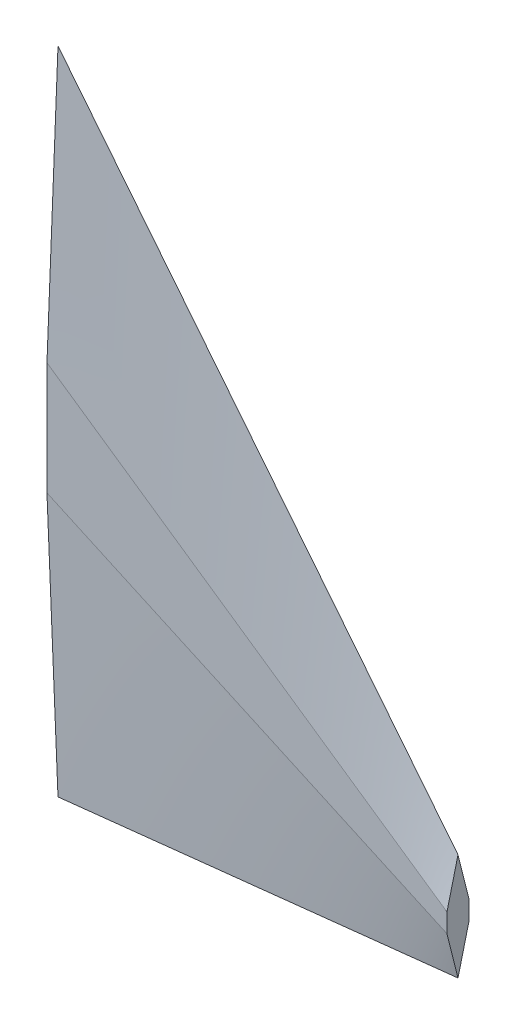
ISO-10303-21;
HEADER;
FILE_DESCRIPTION(('STEP AP214'),'2;1');
FILE_NAME('part.step','',(''),(''),'','','');
FILE_SCHEMA(('AUTOMOTIVE_DESIGN { 1 0 10303 214 1 1 1 1 }'));
ENDSEC;
DATA;
#1=APPLICATION_CONTEXT('core data for automotive mechanical design processes');
#2=APPLICATION_PROTOCOL_DEFINITION('international standard','automotive_design',2000,#1);
#3=PRODUCT_CONTEXT('',#1,'mechanical');
#4=PRODUCT('Part','Part','',(#3));
#5=PRODUCT_RELATED_PRODUCT_CATEGORY('part','',(#4));
#6=PRODUCT_DEFINITION_FORMATION('','',#4);
#7=PRODUCT_DEFINITION_CONTEXT('part definition',#1,'design');
#8=PRODUCT_DEFINITION('design','',#6,#7);
#9=PRODUCT_DEFINITION_SHAPE('','',#8);
#10=(LENGTH_UNIT() NAMED_UNIT(*) SI_UNIT(.MILLI.,.METRE.));
#11=(NAMED_UNIT(*) PLANE_ANGLE_UNIT() SI_UNIT($,.RADIAN.));
#12=(NAMED_UNIT(*) SI_UNIT($,.STERADIAN.) SOLID_ANGLE_UNIT());
#13=UNCERTAINTY_MEASURE_WITH_UNIT(LENGTH_MEASURE(1.E-05),#10,'distance_accuracy_value','');
#14=(GEOMETRIC_REPRESENTATION_CONTEXT(3) GLOBAL_UNCERTAINTY_ASSIGNED_CONTEXT((#13)) GLOBAL_UNIT_ASSIGNED_CONTEXT((#10,
#11,#12)) REPRESENTATION_CONTEXT('',''));
#15=CARTESIAN_POINT('',(0.,0.,0.));
#16=DIRECTION('',(0.,0.,1.));
#17=DIRECTION('',(1.,0.,0.));
#18=AXIS2_PLACEMENT_3D('',#15,#16,#17);
#19=CARTESIAN_POINT('',(91.39,0.,0.));
#20=DIRECTION('',(-1.,0.,0.));
#21=DIRECTION('',(0.,0.,1.));
#22=AXIS2_PLACEMENT_3D('',#19,#20,#21);
#23=PLANE('',#22);
#24=DIRECTION('',(0.,-0.969848293101963,-0.243709434300785));
#25=VECTOR('',#24,1.);
#26=CARTESIAN_POINT('',(91.39,-64.424,0.));
#27=LINE('',#26,#25);
#28=CARTESIAN_POINT('',(91.39,-54.391,2.52115384615387));
#29=VERTEX_POINT('',#28);
#30=CARTESIAN_POINT('',(91.39,-64.424,0.));
#31=VERTEX_POINT('',#30);
#32=EDGE_CURVE('E266',#29,#31,#27,.T.);
#33=ORIENTED_EDGE('',*,*,#32,.T.);
#34=DIRECTION('',(0.,0.969848293101963,-0.243709434300785));
#35=VECTOR('',#34,1.);
#36=CARTESIAN_POINT('',(91.39,-64.424,0.));
#37=LINE('',#36,#35);
#38=CARTESIAN_POINT('',(91.39,-54.391,-2.52115384615387));
#39=VERTEX_POINT('',#38);
#40=EDGE_CURVE('E12',#31,#39,#37,.T.);
#41=ORIENTED_EDGE('',*,*,#40,.T.);
#42=DIRECTION('',(0.,1.,0.));
#43=VECTOR('',#42,1.);
#44=CARTESIAN_POINT('',(91.39,-54.391,-2.52115384615387));
#45=LINE('',#44,#43);
#46=CARTESIAN_POINT('',(91.39,-50.073,-2.52115384615387));
#47=VERTEX_POINT('',#46);
#48=EDGE_CURVE('E60',#39,#47,#45,.T.);
#49=ORIENTED_EDGE('',*,*,#48,.T.);
#50=DIRECTION('',(0.,0.969848293101963,0.243709434300785));
#51=VECTOR('',#50,1.);
#52=CARTESIAN_POINT('',(91.39,-50.073,-2.52115384615387));
#53=LINE('',#52,#51);
#54=CARTESIAN_POINT('',(91.39,-40.04,0.));
#55=VERTEX_POINT('',#54);
#56=EDGE_CURVE('E300',#47,#55,#53,.T.);
#57=ORIENTED_EDGE('',*,*,#56,.T.);
#58=DIRECTION('',(0.,-0.969848293101963,0.243709434300785));
#59=VECTOR('',#58,1.);
#60=CARTESIAN_POINT('',(91.39,-50.073,2.52115384615387));
#61=LINE('',#60,#59);
#62=CARTESIAN_POINT('',(91.39,-50.073,2.52115384615387));
#63=VERTEX_POINT('',#62);
#64=EDGE_CURVE('E74',#55,#63,#61,.T.);
#65=ORIENTED_EDGE('',*,*,#64,.T.);
#66=DIRECTION('',(0.,-1.,0.));
#67=VECTOR('',#66,1.);
#68=CARTESIAN_POINT('',(91.39,-54.391,2.52115384615387));
#69=LINE('',#68,#67);
#70=EDGE_CURVE('E68',#63,#29,#69,.T.);
#71=ORIENTED_EDGE('',*,*,#70,.T.);
#72=EDGE_LOOP('',(#33,#41,#49,#57,#65,#71));
#73=FACE_BOUND('',#72,.T.);
#74=ADVANCED_FACE('F50',(#73),#23,.F.);
#75=CARTESIAN_POINT('',(0.,0.,0.));
#76=DIRECTION('',(1.,0.,0.));
#77=DIRECTION('',(0.,0.,-1.));
#78=AXIS2_PLACEMENT_3D('',#75,#76,#77);
#79=PLANE('',#78);
#80=DIRECTION('',(0.,-0.999158603528769,0.0410132295051167));
#81=VECTOR('',#80,1.);
#82=CARTESIAN_POINT('',(0.,74.29,0.));
#83=LINE('',#82,#81);
#84=CARTESIAN_POINT('',(0.,74.29,0.));
#85=VERTEX_POINT('',#84);
#86=CARTESIAN_POINT('',(0.,12.87,2.52115384615386));
#87=VERTEX_POINT('',#86);
#88=EDGE_CURVE('E111',#85,#87,#83,.T.);
#89=ORIENTED_EDGE('',*,*,#88,.F.);
#90=DIRECTION('',(0.,0.999158603528769,0.041013229505117));
#91=VECTOR('',#90,1.);
#92=CARTESIAN_POINT('',(0.,74.29,0.));
#93=LINE('',#92,#91);
#94=CARTESIAN_POINT('',(0.,12.87,-2.52115384615386));
#95=VERTEX_POINT('',#94);
#96=EDGE_CURVE('E121',#95,#85,#93,.T.);
#97=ORIENTED_EDGE('',*,*,#96,.F.);
#98=DIRECTION('',(0.,1.,0.));
#99=VECTOR('',#98,1.);
#100=CARTESIAN_POINT('',(0.,12.87,-2.52115384615386));
#101=LINE('',#100,#99);
#102=CARTESIAN_POINT('',(0.,-12.87,-2.52115384615386));
#103=VERTEX_POINT('',#102);
#104=EDGE_CURVE('E128',#103,#95,#101,.T.);
#105=ORIENTED_EDGE('',*,*,#104,.F.);
#106=DIRECTION('',(0.,0.999158603528769,-0.0410132295051168));
#107=VECTOR('',#106,1.);
#108=CARTESIAN_POINT('',(0.,-12.87,-2.52115384615386));
#109=LINE('',#108,#107);
#110=CARTESIAN_POINT('',(0.,-74.29,0.));
#111=VERTEX_POINT('',#110);
#112=EDGE_CURVE('E192',#111,#103,#109,.T.);
#113=ORIENTED_EDGE('',*,*,#112,.F.);
#114=DIRECTION('',(0.,-0.999158603528769,-0.0410132295051168));
#115=VECTOR('',#114,1.);
#116=CARTESIAN_POINT('',(0.,-12.87,2.52115384615386));
#117=LINE('',#116,#115);
#118=CARTESIAN_POINT('',(0.,-12.87,2.52115384615386));
#119=VERTEX_POINT('',#118);
#120=EDGE_CURVE('E190',#119,#111,#117,.T.);
#121=ORIENTED_EDGE('',*,*,#120,.F.);
#122=DIRECTION('',(0.,-1.,0.));
#123=VECTOR('',#122,1.);
#124=CARTESIAN_POINT('',(0.,12.87,2.52115384615386));
#125=LINE('',#124,#123);
#126=EDGE_CURVE('E134',#87,#119,#125,.T.);
#127=ORIENTED_EDGE('',*,*,#126,.F.);
#128=EDGE_LOOP('',(#89,#97,#105,#113,#121,#127));
#129=FACE_BOUND('',#128,.T.);
#130=ADVANCED_FACE('F132',(#129),#79,.F.);
#131=CARTESIAN_POINT('',(0.,12.87,-2.52115384615386));
#132=CARTESIAN_POINT('',(91.39,-50.073,-2.52115384615387));
#133=CARTESIAN_POINT('',(0.,23.1066666666667,-2.10096153846155));
#134=CARTESIAN_POINT('',(91.39,-48.4008333333334,-2.10096153846156));
#135=CARTESIAN_POINT('',(0.,33.3433333333334,-1.68076923076923));
#136=CARTESIAN_POINT('',(91.39,-46.7286666666667,-1.68076923076925));
#137=CARTESIAN_POINT('',(0.,53.8166666666667,-0.840384615384611));
#138=CARTESIAN_POINT('',(91.39,-43.3843333333334,-0.840384615384632));
#139=CARTESIAN_POINT('',(0.,64.0533333333334,-0.4201923076923));
#140=CARTESIAN_POINT('',(91.39,-41.7121666666667,-0.420192307692318));
#141=CARTESIAN_POINT('',(0.,74.29,0.));
#142=CARTESIAN_POINT('',(91.39,-40.04,0.));
#143=B_SPLINE_SURFACE_WITH_KNOTS('',3,1,((#131,#132),(#133,#134),(#135,#136),(#137,#138),(#139,
#140),(#141,#142)),.UNSPECIFIED.,.F.,.F.,.F.,(4,2,4),(2,2),(0.,0.5,1.),(0.,1.),.UNSPECIFIED.);
#144=DIRECTION('',(0.624386720645669,-0.781115371172112,0.));
#145=VECTOR('',#144,1.);
#146=CARTESIAN_POINT('',(45.695,17.125,0.));
#147=LINE('',#146,#145);
#148=EDGE_CURVE('E106',#85,#55,#147,.T.);
#149=DIRECTION('',(-0.823568875596605,0.567216278987604,0.));
#150=VECTOR('',#149,1.);
#151=CARTESIAN_POINT('',(45.695,-18.6015,-2.52115384615386));
#152=LINE('',#151,#150);
#153=EDGE_CURVE('E118',#47,#95,#152,.T.);
#154=ORIENTED_EDGE('',*,*,#96,.T.);
#155=ORIENTED_EDGE('',*,*,#148,.T.);
#156=ORIENTED_EDGE('',*,*,#56,.F.);
#157=ORIENTED_EDGE('',*,*,#153,.T.);
#158=EDGE_LOOP('',(#154,#155,#156,#157));
#159=FACE_BOUND('',#158,.T.);
#160=ADVANCED_FACE('F123',(#159),#143,.T.);
#161=CARTESIAN_POINT('',(0.,74.29,0.));
#162=CARTESIAN_POINT('',(91.39,-40.04,0.));
#163=CARTESIAN_POINT('',(0.,64.0533333333334,0.420192307692316));
#164=CARTESIAN_POINT('',(91.39,-41.7121666666663,0.420192307692219));
#165=CARTESIAN_POINT('',(0.,53.8166666666667,0.840384615384624));
#166=CARTESIAN_POINT('',(91.39,-43.3843333333328,0.840384615384485));
#167=CARTESIAN_POINT('',(0.,33.3433333333334,1.68076923076924));
#168=CARTESIAN_POINT('',(91.39,-46.7286666666661,1.68076923076911));
#169=CARTESIAN_POINT('',(0.,23.1066666666667,2.10096153846155));
#170=CARTESIAN_POINT('',(91.39,-48.400833333333,2.10096153846146));
#171=CARTESIAN_POINT('',(0.,12.87,2.52115384615386));
#172=CARTESIAN_POINT('',(91.39,-50.073,2.52115384615387));
#173=B_SPLINE_SURFACE_WITH_KNOTS('',3,1,((#161,#162),(#163,#164),(#165,#166),(#167,#168),(#169,
#170),(#171,#172)),.UNSPECIFIED.,.F.,.F.,.F.,(4,2,4),(2,2),(0.,0.5,1.),(0.,1.),.UNSPECIFIED.);
#174=DIRECTION('',(0.823568875596605,-0.567216278987604,0.));
#175=VECTOR('',#174,1.);
#176=CARTESIAN_POINT('',(45.695,-18.6015,2.52115384615386));
#177=LINE('',#176,#175);
#178=EDGE_CURVE('E117',#87,#63,#177,.T.);
#179=ORIENTED_EDGE('',*,*,#88,.T.);
#180=ORIENTED_EDGE('',*,*,#178,.T.);
#181=ORIENTED_EDGE('',*,*,#64,.F.);
#182=ORIENTED_EDGE('',*,*,#148,.F.);
#183=EDGE_LOOP('',(#179,#180,#181,#182));
#184=FACE_BOUND('',#183,.T.);
#185=ADVANCED_FACE('F108',(#184),#173,.T.);
#186=CARTESIAN_POINT('',(0.,0.,-2.52115384615386));
#187=DIRECTION('',(0.,0.,1.));
#188=DIRECTION('',(1.,0.,0.));
#189=AXIS2_PLACEMENT_3D('',#186,#187,#188);
#190=PLANE('',#189);
#191=ORIENTED_EDGE('',*,*,#153,.F.);
#192=ORIENTED_EDGE('',*,*,#48,.F.);
#193=DIRECTION('',(0.910441178771625,-0.413638562028413,0.));
#194=VECTOR('',#193,1.);
#195=CARTESIAN_POINT('',(45.695,-33.6305,-2.52115384615386));
#196=LINE('',#195,#194);
#197=EDGE_CURVE('E248',#103,#39,#196,.T.);
#198=ORIENTED_EDGE('',*,*,#197,.F.);
#199=ORIENTED_EDGE('',*,*,#104,.T.);
#200=EDGE_LOOP('',(#191,#192,#198,#199));
#201=FACE_BOUND('',#200,.T.);
#202=ADVANCED_FACE('F276',(#201),#190,.F.);
#203=CARTESIAN_POINT('',(0.,0.,2.52115384615386));
#204=DIRECTION('',(0.,0.,-1.));
#205=DIRECTION('',(-1.,0.,0.));
#206=AXIS2_PLACEMENT_3D('',#203,#204,#205);
#207=PLANE('',#206);
#208=DIRECTION('',(0.910441178771625,-0.413638562028413,0.));
#209=VECTOR('',#208,1.);
#210=CARTESIAN_POINT('',(0.,-12.87,2.52115384615386));
#211=LINE('',#210,#209);
#212=EDGE_CURVE('E249',#119,#29,#211,.T.);
#213=ORIENTED_EDGE('',*,*,#212,.T.);
#214=ORIENTED_EDGE('',*,*,#70,.F.);
#215=ORIENTED_EDGE('',*,*,#178,.F.);
#216=ORIENTED_EDGE('',*,*,#126,.T.);
#217=EDGE_LOOP('',(#213,#214,#215,#216));
#218=FACE_BOUND('',#217,.T.);
#219=ADVANCED_FACE('F222',(#218),#207,.F.);
#220=CARTESIAN_POINT('',(0.,-12.87,2.52115384615386));
#221=CARTESIAN_POINT('',(91.39,-54.391,2.52115384615387));
#222=CARTESIAN_POINT('',(0.,-23.1066666666666,2.10096153846155));
#223=CARTESIAN_POINT('',(91.39,-56.0631666666666,2.10096153846157));
#224=CARTESIAN_POINT('',(0.,-33.3433333333333,1.68076923076924));
#225=CARTESIAN_POINT('',(91.39,-57.7353333333333,1.68076923076927));
#226=CARTESIAN_POINT('',(0.,-53.8166666666666,0.840384615384623));
#227=CARTESIAN_POINT('',(91.39,-61.0796666666666,0.840384615384643));
#228=CARTESIAN_POINT('',(0.,-64.0533333333333,0.420192307692312));
#229=CARTESIAN_POINT('',(91.39,-62.7518333333333,0.420192307692325));
#230=CARTESIAN_POINT('',(0.,-74.29,0.));
#231=CARTESIAN_POINT('',(91.39,-64.424,0.));
#232=B_SPLINE_SURFACE_WITH_KNOTS('',3,1,((#220,#221),(#222,#223),(#224,#225),(#226,#227),(#228,
#229),(#230,#231)),.UNSPECIFIED.,.F.,.F.,.F.,(4,2,4),(2,2),(0.,0.5,1.),(0.,1.),.UNSPECIFIED.);
#233=DIRECTION('',(0.994223311326964,0.107331296526445,0.));
#234=VECTOR('',#233,1.);
#235=CARTESIAN_POINT('',(45.695,-69.357,0.));
#236=LINE('',#235,#234);
#237=EDGE_CURVE('E241',#111,#31,#236,.T.);
#238=ORIENTED_EDGE('',*,*,#120,.T.);
#239=ORIENTED_EDGE('',*,*,#237,.T.);
#240=ORIENTED_EDGE('',*,*,#32,.F.);
#241=ORIENTED_EDGE('',*,*,#212,.F.);
#242=EDGE_LOOP('',(#238,#239,#240,#241));
#243=FACE_BOUND('',#242,.T.);
#244=ADVANCED_FACE('F210',(#243),#232,.T.);
#245=CARTESIAN_POINT('',(0.,-74.29,0.));
#246=CARTESIAN_POINT('',(91.39,-64.424,0.));
#247=CARTESIAN_POINT('',(0.,-64.0533333333334,-0.420192307692308));
#248=CARTESIAN_POINT('',(91.39,-62.7518333333333,-0.420192307692314));
#249=CARTESIAN_POINT('',(0.,-53.8166666666667,-0.840384615384618));
#250=CARTESIAN_POINT('',(91.39,-61.0796666666666,-0.840384615384627));
#251=CARTESIAN_POINT('',(0.,-33.3433333333334,-1.68076923076924));
#252=CARTESIAN_POINT('',(91.39,-57.7353333333333,-1.68076923076925));
#253=CARTESIAN_POINT('',(0.,-23.1066666666667,-2.10096153846155));
#254=CARTESIAN_POINT('',(91.39,-56.0631666666666,-2.10096153846156));
#255=CARTESIAN_POINT('',(0.,-12.87,-2.52115384615386));
#256=CARTESIAN_POINT('',(91.39,-54.391,-2.52115384615387));
#257=B_SPLINE_SURFACE_WITH_KNOTS('',3,1,((#245,#246),(#247,#248),(#249,#250),(#251,#252),(#253,
#254),(#255,#256)),.UNSPECIFIED.,.F.,.F.,.F.,(4,2,4),(2,2),(0.,0.5,1.),(0.,1.),.UNSPECIFIED.);
#258=ORIENTED_EDGE('',*,*,#112,.T.);
#259=ORIENTED_EDGE('',*,*,#197,.T.);
#260=ORIENTED_EDGE('',*,*,#40,.F.);
#261=ORIENTED_EDGE('',*,*,#237,.F.);
#262=EDGE_LOOP('',(#258,#259,#260,#261));
#263=FACE_BOUND('',#262,.T.);
#264=ADVANCED_FACE('F221',(#263),#257,.T.);
#265=CLOSED_SHELL('',(#74,#130,#160,#185,#202,#219,#244,#264));
#266=MANIFOLD_SOLID_BREP('B2',#265);
#267=ADVANCED_BREP_SHAPE_REPRESENTATION('',(#18,#266),#14);
#268=SHAPE_DEFINITION_REPRESENTATION(#9,#267);
ENDSEC;
END-ISO-10303-21;
